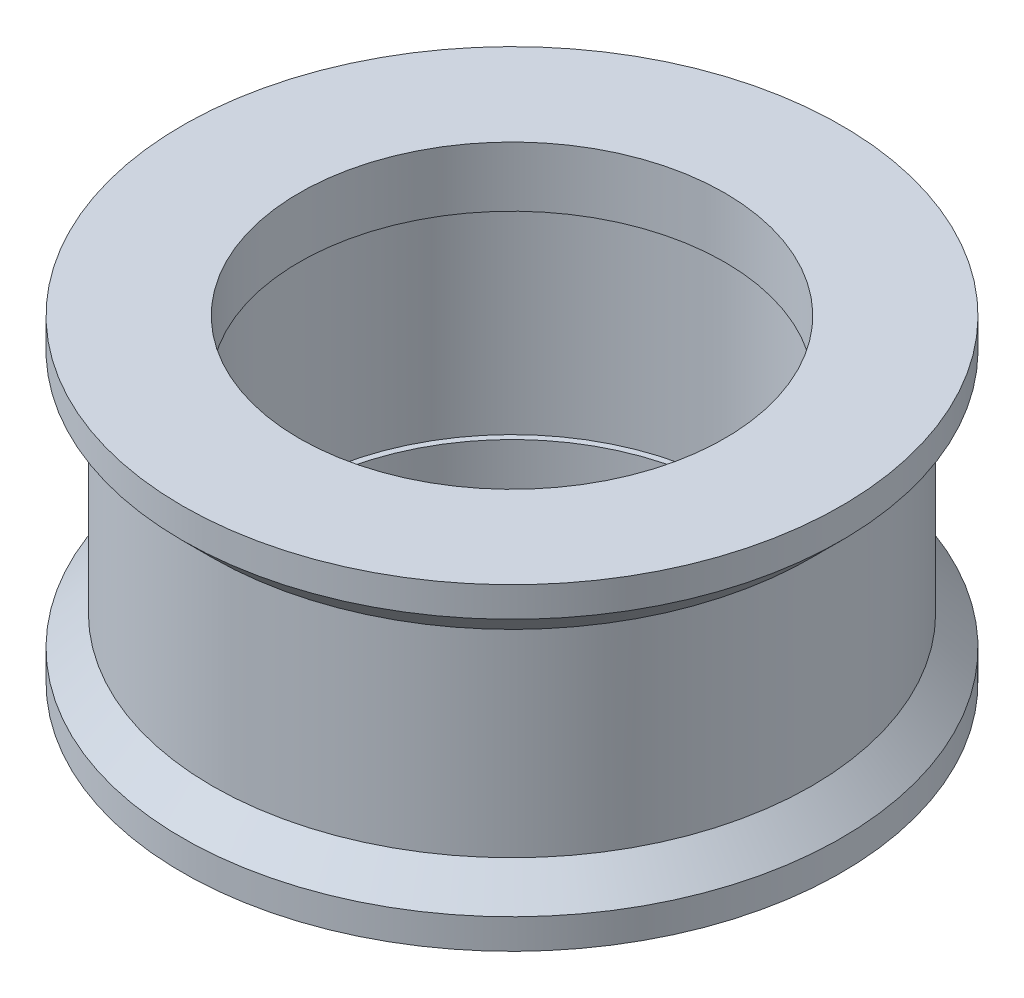
ISO-10303-21;
HEADER;
FILE_DESCRIPTION(('STEP AP214'),'2;1');
FILE_NAME('part.step','',(''),(''),'','','');
FILE_SCHEMA(('AUTOMOTIVE_DESIGN { 1 0 10303 214 1 1 1 1 }'));
ENDSEC;
DATA;
#1=APPLICATION_CONTEXT('core data for automotive mechanical design processes');
#2=APPLICATION_PROTOCOL_DEFINITION('international standard','automotive_design',2000,#1);
#3=PRODUCT_CONTEXT('',#1,'mechanical');
#4=PRODUCT('Part','Part','',(#3));
#5=PRODUCT_RELATED_PRODUCT_CATEGORY('part','',(#4));
#6=PRODUCT_DEFINITION_FORMATION('','',#4);
#7=PRODUCT_DEFINITION_CONTEXT('part definition',#1,'design');
#8=PRODUCT_DEFINITION('design','',#6,#7);
#9=PRODUCT_DEFINITION_SHAPE('','',#8);
#10=(LENGTH_UNIT() NAMED_UNIT(*) SI_UNIT(.MILLI.,.METRE.));
#11=(NAMED_UNIT(*) PLANE_ANGLE_UNIT() SI_UNIT($,.RADIAN.));
#12=(NAMED_UNIT(*) SI_UNIT($,.STERADIAN.) SOLID_ANGLE_UNIT());
#13=UNCERTAINTY_MEASURE_WITH_UNIT(LENGTH_MEASURE(1.E-05),#10,'distance_accuracy_value','');
#14=(GEOMETRIC_REPRESENTATION_CONTEXT(3) GLOBAL_UNCERTAINTY_ASSIGNED_CONTEXT((#13)) GLOBAL_UNIT_ASSIGNED_CONTEXT((#10,
#11,#12)) REPRESENTATION_CONTEXT('',''));
#15=CARTESIAN_POINT('',(0.,0.,0.));
#16=DIRECTION('',(0.,0.,1.));
#17=DIRECTION('',(1.,0.,0.));
#18=AXIS2_PLACEMENT_3D('',#15,#16,#17);
#19=CARTESIAN_POINT('',(0.,3.3,0.));
#20=DIRECTION('',(0.,-1.,0.));
#21=DIRECTION('',(0.,0.,-1.));
#22=AXIS2_PLACEMENT_3D('',#19,#20,#21);
#23=CYLINDRICAL_SURFACE('',#22,5.);
#24=CARTESIAN_POINT('',(0.,3.3,0.));
#25=DIRECTION('',(0.,1.,0.));
#26=DIRECTION('',(0.,0.,1.));
#27=AXIS2_PLACEMENT_3D('',#24,#25,#26);
#28=CIRCLE('',#27,5.);
#29=CARTESIAN_POINT('',(0.,3.3,5.));
#30=VERTEX_POINT('',#29);
#31=EDGE_CURVE('E53',#30,#30,#28,.T.);
#32=ORIENTED_EDGE('',*,*,#31,.F.);
#33=EDGE_LOOP('',(#32));
#34=FACE_BOUND('',#33,.T.);
#35=CARTESIAN_POINT('',(0.,0.,0.));
#36=DIRECTION('',(0.,1.,0.));
#37=DIRECTION('',(0.,0.,1.));
#38=AXIS2_PLACEMENT_3D('',#35,#36,#37);
#39=CIRCLE('',#38,5.);
#40=CARTESIAN_POINT('',(0.,0.,5.));
#41=VERTEX_POINT('',#40);
#42=EDGE_CURVE('E61',#41,#41,#39,.T.);
#43=ORIENTED_EDGE('',*,*,#42,.T.);
#44=EDGE_LOOP('',(#43));
#45=FACE_BOUND('',#44,.T.);
#46=ADVANCED_FACE('F39',(#34,#45),#23,.T.);
#47=CARTESIAN_POINT('',(0.,3.3,0.));
#48=DIRECTION('',(0.,-1.,0.));
#49=DIRECTION('',(0.,0.,-1.));
#50=AXIS2_PLACEMENT_3D('',#47,#48,#49);
#51=CYLINDRICAL_SURFACE('',#50,3.65);
#52=CARTESIAN_POINT('',(0.,3.3,0.));
#53=DIRECTION('',(0.,1.,0.));
#54=DIRECTION('',(0.,0.,1.));
#55=AXIS2_PLACEMENT_3D('',#52,#53,#54);
#56=CIRCLE('',#55,3.65);
#57=CARTESIAN_POINT('',(0.,3.3,3.65));
#58=VERTEX_POINT('',#57);
#59=EDGE_CURVE('E69',#58,#58,#56,.T.);
#60=ORIENTED_EDGE('',*,*,#59,.T.);
#61=EDGE_LOOP('',(#60));
#62=FACE_BOUND('',#61,.T.);
#63=CARTESIAN_POINT('',(0.,0.,0.));
#64=DIRECTION('',(0.,1.,0.));
#65=DIRECTION('',(0.,0.,1.));
#66=AXIS2_PLACEMENT_3D('',#63,#64,#65);
#67=CIRCLE('',#66,3.65);
#68=CARTESIAN_POINT('',(0.,0.,3.65));
#69=VERTEX_POINT('',#68);
#70=EDGE_CURVE('E58',#69,#69,#67,.T.);
#71=ORIENTED_EDGE('',*,*,#70,.F.);
#72=EDGE_LOOP('',(#71));
#73=FACE_BOUND('',#72,.T.);
#74=ADVANCED_FACE('F116',(#62,#73),#51,.F.);
#75=CARTESIAN_POINT('',(0.,0.,0.));
#76=DIRECTION('',(0.,-1.,0.));
#77=DIRECTION('',(0.,0.,-1.));
#78=AXIS2_PLACEMENT_3D('',#75,#76,#77);
#79=PLANE('',#78);
#80=CARTESIAN_POINT('',(0.,0.,0.));
#81=DIRECTION('',(0.,-1.,0.));
#82=DIRECTION('',(0.,0.,-1.));
#83=AXIS2_PLACEMENT_3D('',#80,#81,#82);
#84=CIRCLE('',#83,3.55);
#85=CARTESIAN_POINT('',(0.,0.,-3.55));
#86=VERTEX_POINT('',#85);
#87=EDGE_CURVE('E73',#86,#86,#84,.T.);
#88=ORIENTED_EDGE('',*,*,#87,.T.);
#89=EDGE_LOOP('',(#88));
#90=FACE_BOUND('',#89,.T.);
#91=ORIENTED_EDGE('',*,*,#70,.T.);
#92=EDGE_LOOP('',(#91));
#93=FACE_BOUND('',#92,.T.);
#94=ADVANCED_FACE('F122',(#90,#93),#79,.F.);
#95=CARTESIAN_POINT('',(0.,-1.,0.));
#96=DIRECTION('',(0.,-1.,0.));
#97=DIRECTION('',(0.,0.,-1.));
#98=AXIS2_PLACEMENT_3D('',#95,#96,#97);
#99=PLANE('',#98);
#100=CARTESIAN_POINT('',(0.,-1.,0.));
#101=DIRECTION('',(0.,-1.,0.));
#102=DIRECTION('',(0.,0.,-1.));
#103=AXIS2_PLACEMENT_3D('',#100,#101,#102);
#104=CIRCLE('',#103,5.5);
#105=CARTESIAN_POINT('',(0.,-1.,-5.5));
#106=VERTEX_POINT('',#105);
#107=EDGE_CURVE('E64',#106,#106,#104,.T.);
#108=ORIENTED_EDGE('',*,*,#107,.T.);
#109=EDGE_LOOP('',(#108));
#110=FACE_BOUND('',#109,.T.);
#111=CARTESIAN_POINT('',(0.,-1.,0.));
#112=DIRECTION('',(0.,-1.,0.));
#113=DIRECTION('',(0.,0.,-1.));
#114=AXIS2_PLACEMENT_3D('',#111,#112,#113);
#115=CIRCLE('',#114,3.55);
#116=CARTESIAN_POINT('',(0.,-1.,-3.55));
#117=VERTEX_POINT('',#116);
#118=EDGE_CURVE('E78',#117,#117,#115,.T.);
#119=ORIENTED_EDGE('',*,*,#118,.F.);
#120=EDGE_LOOP('',(#119));
#121=FACE_BOUND('',#120,.T.);
#122=ADVANCED_FACE('F168',(#110,#121),#99,.T.);
#123=CARTESIAN_POINT('',(0.,-1.,0.));
#124=DIRECTION('',(0.,1.,0.));
#125=DIRECTION('',(0.,0.,1.));
#126=AXIS2_PLACEMENT_3D('',#123,#124,#125);
#127=CYLINDRICAL_SURFACE('',#126,5.5);
#128=CARTESIAN_POINT('',(0.,-0.5,0.));
#129=DIRECTION('',(0.,-1.,0.));
#130=DIRECTION('',(0.,0.,-1.));
#131=AXIS2_PLACEMENT_3D('',#128,#129,#130);
#132=CIRCLE('',#131,5.5);
#133=CARTESIAN_POINT('',(0.,-0.5,-5.5));
#134=VERTEX_POINT('',#133);
#135=EDGE_CURVE('E10',#134,#134,#132,.T.);
#136=ORIENTED_EDGE('',*,*,#135,.T.);
#137=EDGE_LOOP('',(#136));
#138=FACE_BOUND('',#137,.T.);
#139=ORIENTED_EDGE('',*,*,#107,.F.);
#140=EDGE_LOOP('',(#139));
#141=FACE_BOUND('',#140,.T.);
#142=ADVANCED_FACE('F152',(#138,#141),#127,.T.);
#143=CARTESIAN_POINT('',(0.,-1.,0.));
#144=DIRECTION('',(0.,1.,0.));
#145=DIRECTION('',(0.,0.,1.));
#146=AXIS2_PLACEMENT_3D('',#143,#144,#145);
#147=CYLINDRICAL_SURFACE('',#146,3.55);
#148=ORIENTED_EDGE('',*,*,#118,.T.);
#149=EDGE_LOOP('',(#148));
#150=FACE_BOUND('',#149,.T.);
#151=ORIENTED_EDGE('',*,*,#87,.F.);
#152=EDGE_LOOP('',(#151));
#153=FACE_BOUND('',#152,.T.);
#154=ADVANCED_FACE('F111',(#150,#153),#147,.F.);
#155=CARTESIAN_POINT('',(0.,3.3,0.));
#156=DIRECTION('',(0.,1.,0.));
#157=DIRECTION('',(0.,0.,1.));
#158=AXIS2_PLACEMENT_3D('',#155,#156,#157);
#159=PLANE('',#158);
#160=CARTESIAN_POINT('',(0.,3.3,0.));
#161=DIRECTION('',(0.,1.,0.));
#162=DIRECTION('',(0.,0.,1.));
#163=AXIS2_PLACEMENT_3D('',#160,#161,#162);
#164=CIRCLE('',#163,3.55);
#165=CARTESIAN_POINT('',(0.,3.3,3.55));
#166=VERTEX_POINT('',#165);
#167=EDGE_CURVE('E89',#166,#166,#164,.T.);
#168=ORIENTED_EDGE('',*,*,#167,.T.);
#169=EDGE_LOOP('',(#168));
#170=FACE_BOUND('',#169,.T.);
#171=ORIENTED_EDGE('',*,*,#59,.F.);
#172=EDGE_LOOP('',(#171));
#173=FACE_BOUND('',#172,.T.);
#174=ADVANCED_FACE('F103',(#170,#173),#159,.F.);
#175=CARTESIAN_POINT('',(0.,4.3,0.));
#176=DIRECTION('',(0.,1.,0.));
#177=DIRECTION('',(0.,0.,1.));
#178=AXIS2_PLACEMENT_3D('',#175,#176,#177);
#179=PLANE('',#178);
#180=CARTESIAN_POINT('',(0.,4.3,0.));
#181=DIRECTION('',(0.,1.,0.));
#182=DIRECTION('',(0.,0.,1.));
#183=AXIS2_PLACEMENT_3D('',#180,#181,#182);
#184=CIRCLE('',#183,5.5);
#185=CARTESIAN_POINT('',(0.,4.3,5.5));
#186=VERTEX_POINT('',#185);
#187=EDGE_CURVE('E74',#186,#186,#184,.T.);
#188=ORIENTED_EDGE('',*,*,#187,.T.);
#189=EDGE_LOOP('',(#188));
#190=FACE_BOUND('',#189,.T.);
#191=CARTESIAN_POINT('',(0.,4.3,0.));
#192=DIRECTION('',(0.,1.,0.));
#193=DIRECTION('',(0.,0.,1.));
#194=AXIS2_PLACEMENT_3D('',#191,#192,#193);
#195=CIRCLE('',#194,3.55);
#196=CARTESIAN_POINT('',(0.,4.3,3.55));
#197=VERTEX_POINT('',#196);
#198=EDGE_CURVE('E88',#197,#197,#195,.T.);
#199=ORIENTED_EDGE('',*,*,#198,.F.);
#200=EDGE_LOOP('',(#199));
#201=FACE_BOUND('',#200,.T.);
#202=ADVANCED_FACE('F100',(#190,#201),#179,.T.);
#203=CARTESIAN_POINT('',(0.,4.3,0.));
#204=DIRECTION('',(0.,-1.,0.));
#205=DIRECTION('',(0.,0.,-1.));
#206=AXIS2_PLACEMENT_3D('',#203,#204,#205);
#207=CYLINDRICAL_SURFACE('',#206,5.5);
#208=CARTESIAN_POINT('',(0.,3.8,0.));
#209=DIRECTION('',(0.,1.,0.));
#210=DIRECTION('',(0.,0.,1.));
#211=AXIS2_PLACEMENT_3D('',#208,#209,#210);
#212=CIRCLE('',#211,5.5);
#213=CARTESIAN_POINT('',(0.,3.8,5.5));
#214=VERTEX_POINT('',#213);
#215=EDGE_CURVE('E48',#214,#214,#212,.T.);
#216=ORIENTED_EDGE('',*,*,#215,.T.);
#217=EDGE_LOOP('',(#216));
#218=FACE_BOUND('',#217,.T.);
#219=ORIENTED_EDGE('',*,*,#187,.F.);
#220=EDGE_LOOP('',(#219));
#221=FACE_BOUND('',#220,.T.);
#222=ADVANCED_FACE('F102',(#218,#221),#207,.T.);
#223=CARTESIAN_POINT('',(0.,4.3,0.));
#224=DIRECTION('',(0.,-1.,0.));
#225=DIRECTION('',(0.,0.,-1.));
#226=AXIS2_PLACEMENT_3D('',#223,#224,#225);
#227=CYLINDRICAL_SURFACE('',#226,3.55);
#228=ORIENTED_EDGE('',*,*,#198,.T.);
#229=EDGE_LOOP('',(#228));
#230=FACE_BOUND('',#229,.T.);
#231=ORIENTED_EDGE('',*,*,#167,.F.);
#232=EDGE_LOOP('',(#231));
#233=FACE_BOUND('',#232,.T.);
#234=ADVANCED_FACE('F97',(#230,#233),#227,.F.);
#235=CARTESIAN_POINT('',(0.,3.8,0.));
#236=DIRECTION('',(0.,1.,0.));
#237=DIRECTION('',(0.,0.,1.));
#238=AXIS2_PLACEMENT_3D('',#235,#236,#237);
#239=CONICAL_SURFACE('',#238,5.5,0.78539816339745);
#240=ORIENTED_EDGE('',*,*,#31,.T.);
#241=EDGE_LOOP('',(#240));
#242=FACE_BOUND('',#241,.T.);
#243=ORIENTED_EDGE('',*,*,#215,.F.);
#244=EDGE_LOOP('',(#243));
#245=FACE_BOUND('',#244,.T.);
#246=ADVANCED_FACE('F129',(#242,#245),#239,.T.);
#247=CARTESIAN_POINT('',(0.,-0.5,0.));
#248=DIRECTION('',(0.,-1.,0.));
#249=DIRECTION('',(0.,0.,-1.));
#250=AXIS2_PLACEMENT_3D('',#247,#248,#249);
#251=CONICAL_SURFACE('',#250,5.5,0.78539816339745);
#252=ORIENTED_EDGE('',*,*,#42,.F.);
#253=EDGE_LOOP('',(#252));
#254=FACE_BOUND('',#253,.T.);
#255=ORIENTED_EDGE('',*,*,#135,.F.);
#256=EDGE_LOOP('',(#255));
#257=FACE_BOUND('',#256,.T.);
#258=ADVANCED_FACE('F42',(#254,#257),#251,.T.);
#259=CLOSED_SHELL('',(#46,#74,#94,#122,#142,#154,#174,#202,#222,#234,#246,#258));
#260=MANIFOLD_SOLID_BREP('B2',#259);
#261=ADVANCED_BREP_SHAPE_REPRESENTATION('',(#18,#260),#14);
#262=SHAPE_DEFINITION_REPRESENTATION(#9,#261);
ENDSEC;
END-ISO-10303-21;
